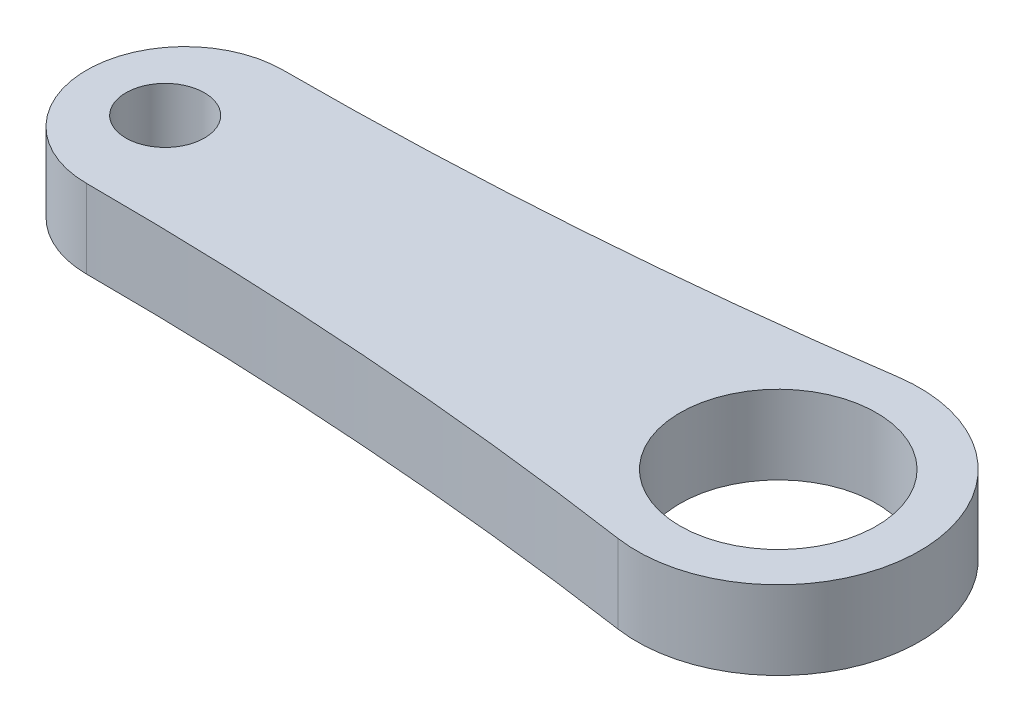
ISO-10303-21;
HEADER;
FILE_DESCRIPTION(('STEP AP214'),'2;1');
FILE_NAME('part.step','',(''),(''),'','','');
FILE_SCHEMA(('AUTOMOTIVE_DESIGN { 1 0 10303 214 1 1 1 1 }'));
ENDSEC;
DATA;
#1=APPLICATION_CONTEXT('core data for automotive mechanical design processes');
#2=APPLICATION_PROTOCOL_DEFINITION('international standard','automotive_design',2000,#1);
#3=PRODUCT_CONTEXT('',#1,'mechanical');
#4=PRODUCT('Part','Part','',(#3));
#5=PRODUCT_RELATED_PRODUCT_CATEGORY('part','',(#4));
#6=PRODUCT_DEFINITION_FORMATION('','',#4);
#7=PRODUCT_DEFINITION_CONTEXT('part definition',#1,'design');
#8=PRODUCT_DEFINITION('design','',#6,#7);
#9=PRODUCT_DEFINITION_SHAPE('','',#8);
#10=(LENGTH_UNIT() NAMED_UNIT(*) SI_UNIT(.MILLI.,.METRE.));
#11=(NAMED_UNIT(*) PLANE_ANGLE_UNIT() SI_UNIT($,.RADIAN.));
#12=(NAMED_UNIT(*) SI_UNIT($,.STERADIAN.) SOLID_ANGLE_UNIT());
#13=UNCERTAINTY_MEASURE_WITH_UNIT(LENGTH_MEASURE(1.E-05),#10,'distance_accuracy_value','');
#14=(GEOMETRIC_REPRESENTATION_CONTEXT(3) GLOBAL_UNCERTAINTY_ASSIGNED_CONTEXT((#13)) GLOBAL_UNIT_ASSIGNED_CONTEXT((#10,
#11,#12)) REPRESENTATION_CONTEXT('',''));
#15=CARTESIAN_POINT('',(0.,0.,0.));
#16=DIRECTION('',(0.,0.,1.));
#17=DIRECTION('',(1.,0.,0.));
#18=AXIS2_PLACEMENT_3D('',#15,#16,#17);
#19=CARTESIAN_POINT('',(-19.7657860921375,46.4356427517146,18.8449153965626));
#20=DIRECTION('',(0.,1.,0.));
#21=DIRECTION('',(0.,0.,1.));
#22=AXIS2_PLACEMENT_3D('',#19,#20,#21);
#23=PLANE('',#22);
#24=CARTESIAN_POINT('',(-4.65554131766961,46.4356427517146,18.8449153965626));
#25=DIRECTION('',(0.,1.,0.));
#26=DIRECTION('',(0.,0.,1.));
#27=AXIS2_PLACEMENT_3D('',#24,#25,#26);
#28=CIRCLE('',#27,2.5);
#29=CARTESIAN_POINT('',(-4.65554131766961,46.4356427517146,21.3449153965626));
#30=VERTEX_POINT('',#29);
#31=EDGE_CURVE('E102',#30,#30,#28,.T.);
#32=ORIENTED_EDGE('',*,*,#31,.F.);
#33=EDGE_LOOP('',(#32));
#34=FACE_BOUND('',#33,.T.);
#35=CARTESIAN_POINT('',(-4.65554131766961,46.4356427517146,18.8449153965626));
#36=DIRECTION('',(0.,1.,0.));
#37=DIRECTION('',(0.,0.,1.));
#38=AXIS2_PLACEMENT_3D('',#35,#36,#37);
#39=CIRCLE('',#38,3.6);
#40=CARTESIAN_POINT('',(-5.17626048145254,46.4356427517146,22.4070568244777));
#41=VERTEX_POINT('',#40);
#42=CARTESIAN_POINT('',(-5.17626048145254,46.4356427517146,15.2827739686475));
#43=VERTEX_POINT('',#42);
#44=EDGE_CURVE('E109',#41,#43,#39,.T.);
#45=ORIENTED_EDGE('',*,*,#44,.T.);
#46=CARTESIAN_POINT('',(-19.7853259098069,46.4356427517146,-84.6550827589713));
#47=DIRECTION('',(0.,1.,0.));
#48=DIRECTION('',(0.,0.,1.));
#49=AXIS2_PLACEMENT_3D('',#46,#47,#48);
#50=CIRCLE('',#49,101.);
#51=CARTESIAN_POINT('',(-19.7662580684097,46.4356427517146,16.3449154411149));
#52=VERTEX_POINT('',#51);
#53=EDGE_CURVE('E87',#43,#52,#50,.F.);
#54=ORIENTED_EDGE('',*,*,#53,.T.);
#55=CARTESIAN_POINT('',(-19.7657860921375,46.4356427517146,18.8449153965626));
#56=DIRECTION('',(0.,1.,0.));
#57=DIRECTION('',(0.,0.,1.));
#58=AXIS2_PLACEMENT_3D('',#55,#56,#57);
#59=CIRCLE('',#58,2.5);
#60=CARTESIAN_POINT('',(-19.7662580684097,46.4356427517146,21.3449153520103));
#61=VERTEX_POINT('',#60);
#62=EDGE_CURVE('E95',#52,#61,#59,.T.);
#63=ORIENTED_EDGE('',*,*,#62,.T.);
#64=CARTESIAN_POINT('',(-19.7853259098069,46.4356427517146,122.344913552097));
#65=DIRECTION('',(0.,1.,0.));
#66=DIRECTION('',(0.,0.,1.));
#67=AXIS2_PLACEMENT_3D('',#64,#65,#66);
#68=CIRCLE('',#67,101.);
#69=EDGE_CURVE('E11',#61,#41,#68,.F.);
#70=ORIENTED_EDGE('',*,*,#69,.T.);
#71=EDGE_LOOP('',(#45,#54,#63,#70));
#72=FACE_BOUND('',#71,.T.);
#73=CARTESIAN_POINT('',(-20.2657860921375,46.4356427517146,18.8449153965626));
#74=DIRECTION('',(0.,1.,0.));
#75=DIRECTION('',(0.,0.,1.));
#76=AXIS2_PLACEMENT_3D('',#73,#74,#75);
#77=CIRCLE('',#76,1.);
#78=CARTESIAN_POINT('',(-20.2657860921375,46.4356427517146,19.8449153965626));
#79=VERTEX_POINT('',#78);
#80=EDGE_CURVE('E120',#79,#79,#77,.T.);
#81=ORIENTED_EDGE('',*,*,#80,.F.);
#82=EDGE_LOOP('',(#81));
#83=FACE_BOUND('',#82,.T.);
#84=ADVANCED_FACE('F39',(#34,#72,#83),#23,.T.);
#85=CARTESIAN_POINT('',(-19.7657860921375,44.4356427517146,18.8449153965626));
#86=DIRECTION('',(0.,1.,0.));
#87=DIRECTION('',(0.,0.,1.));
#88=AXIS2_PLACEMENT_3D('',#85,#86,#87);
#89=PLANE('',#88);
#90=CARTESIAN_POINT('',(-19.7657860921375,44.4356427517146,18.8449153965626));
#91=DIRECTION('',(0.,1.,0.));
#92=DIRECTION('',(0.,0.,1.));
#93=AXIS2_PLACEMENT_3D('',#90,#91,#92);
#94=CIRCLE('',#93,2.5);
#95=CARTESIAN_POINT('',(-19.7662580684097,44.4356427517146,16.3449154411149));
#96=VERTEX_POINT('',#95);
#97=CARTESIAN_POINT('',(-19.7662580684097,44.4356427517146,21.3449153520103));
#98=VERTEX_POINT('',#97);
#99=EDGE_CURVE('E93',#96,#98,#94,.T.);
#100=ORIENTED_EDGE('',*,*,#99,.F.);
#101=CARTESIAN_POINT('',(-19.7853259098069,44.4356427517146,-84.6550827589713));
#102=DIRECTION('',(0.,1.,0.));
#103=DIRECTION('',(0.,0.,1.));
#104=AXIS2_PLACEMENT_3D('',#101,#102,#103);
#105=CIRCLE('',#104,101.);
#106=CARTESIAN_POINT('',(-5.17626048145254,44.4356427517146,15.2827739686475));
#107=VERTEX_POINT('',#106);
#108=EDGE_CURVE('E79',#96,#107,#105,.T.);
#109=ORIENTED_EDGE('',*,*,#108,.T.);
#110=CARTESIAN_POINT('',(-4.65554131766961,44.4356427517146,18.8449153965626));
#111=DIRECTION('',(0.,1.,0.));
#112=DIRECTION('',(0.,0.,1.));
#113=AXIS2_PLACEMENT_3D('',#110,#111,#112);
#114=CIRCLE('',#113,3.6);
#115=CARTESIAN_POINT('',(-5.17626048145254,44.4356427517146,22.4070568244777));
#116=VERTEX_POINT('',#115);
#117=EDGE_CURVE('E101',#116,#107,#114,.T.);
#118=ORIENTED_EDGE('',*,*,#117,.F.);
#119=CARTESIAN_POINT('',(-19.7853259098069,44.4356427517146,122.344913552097));
#120=DIRECTION('',(0.,1.,0.));
#121=DIRECTION('',(0.,0.,1.));
#122=AXIS2_PLACEMENT_3D('',#119,#120,#121);
#123=CIRCLE('',#122,101.);
#124=EDGE_CURVE('E47',#116,#98,#123,.T.);
#125=ORIENTED_EDGE('',*,*,#124,.T.);
#126=EDGE_LOOP('',(#100,#109,#118,#125));
#127=FACE_BOUND('',#126,.T.);
#128=CARTESIAN_POINT('',(-4.65554131766961,44.4356427517146,18.8449153965626));
#129=DIRECTION('',(0.,1.,0.));
#130=DIRECTION('',(0.,0.,1.));
#131=AXIS2_PLACEMENT_3D('',#128,#129,#130);
#132=CIRCLE('',#131,2.5);
#133=CARTESIAN_POINT('',(-4.65554131766961,44.4356427517146,21.3449153965626));
#134=VERTEX_POINT('',#133);
#135=EDGE_CURVE('E106',#134,#134,#132,.T.);
#136=ORIENTED_EDGE('',*,*,#135,.T.);
#137=EDGE_LOOP('',(#136));
#138=FACE_BOUND('',#137,.T.);
#139=CARTESIAN_POINT('',(-20.2657860921375,44.4356427517146,18.8449153965626));
#140=DIRECTION('',(0.,1.,0.));
#141=DIRECTION('',(0.,0.,1.));
#142=AXIS2_PLACEMENT_3D('',#139,#140,#141);
#143=CIRCLE('',#142,1.);
#144=CARTESIAN_POINT('',(-20.2657860921375,44.4356427517146,19.8449153965626));
#145=VERTEX_POINT('',#144);
#146=EDGE_CURVE('E122',#145,#145,#143,.T.);
#147=ORIENTED_EDGE('',*,*,#146,.T.);
#148=EDGE_LOOP('',(#147));
#149=FACE_BOUND('',#148,.T.);
#150=ADVANCED_FACE('F99',(#127,#138,#149),#89,.F.);
#151=CARTESIAN_POINT('',(-19.7657860921375,46.4356427517146,18.8449153965626));
#152=DIRECTION('',(0.,-1.,0.));
#153=DIRECTION('',(0.,0.,-1.));
#154=AXIS2_PLACEMENT_3D('',#151,#152,#153);
#155=CYLINDRICAL_SURFACE('',#154,2.5);
#156=ORIENTED_EDGE('',*,*,#62,.F.);
#157=DIRECTION('',(0.,-1.,0.));
#158=VECTOR('',#157,1.);
#159=CARTESIAN_POINT('',(-19.7662580684097,46.4356427517146,16.3449154411149));
#160=LINE('',#159,#158);
#161=EDGE_CURVE('E83',#52,#96,#160,.T.);
#162=ORIENTED_EDGE('',*,*,#161,.T.);
#163=ORIENTED_EDGE('',*,*,#99,.T.);
#164=DIRECTION('',(0.,-1.,0.));
#165=VECTOR('',#164,1.);
#166=CARTESIAN_POINT('',(-19.7662580684097,46.4356427517146,21.3449153520103));
#167=LINE('',#166,#165);
#168=EDGE_CURVE('E97',#98,#61,#167,.F.);
#169=ORIENTED_EDGE('',*,*,#168,.T.);
#170=EDGE_LOOP('',(#156,#162,#163,#169));
#171=FACE_BOUND('',#170,.T.);
#172=ADVANCED_FACE('F92',(#171),#155,.T.);
#173=CARTESIAN_POINT('',(-4.65554131766961,46.4356427517146,18.8449153965626));
#174=DIRECTION('',(0.,-1.,0.));
#175=DIRECTION('',(0.,0.,-1.));
#176=AXIS2_PLACEMENT_3D('',#173,#174,#175);
#177=CYLINDRICAL_SURFACE('',#176,3.6);
#178=ORIENTED_EDGE('',*,*,#117,.T.);
#179=DIRECTION('',(0.,-1.,0.));
#180=VECTOR('',#179,1.);
#181=CARTESIAN_POINT('',(-5.17626048145254,46.4356427517146,15.2827739686475));
#182=LINE('',#181,#180);
#183=EDGE_CURVE('E54',#107,#43,#182,.F.);
#184=ORIENTED_EDGE('',*,*,#183,.T.);
#185=ORIENTED_EDGE('',*,*,#44,.F.);
#186=DIRECTION('',(0.,-1.,0.));
#187=VECTOR('',#186,1.);
#188=CARTESIAN_POINT('',(-5.17626048145254,46.4356427517146,22.4070568244777));
#189=LINE('',#188,#187);
#190=EDGE_CURVE('E96',#41,#116,#189,.T.);
#191=ORIENTED_EDGE('',*,*,#190,.T.);
#192=EDGE_LOOP('',(#178,#184,#185,#191));
#193=FACE_BOUND('',#192,.T.);
#194=ADVANCED_FACE('F143',(#193),#177,.T.);
#195=CARTESIAN_POINT('',(-4.65554131766961,46.4356427517146,18.8449153965626));
#196=DIRECTION('',(0.,-1.,0.));
#197=DIRECTION('',(0.,0.,-1.));
#198=AXIS2_PLACEMENT_3D('',#195,#196,#197);
#199=CYLINDRICAL_SURFACE('',#198,2.5);
#200=ORIENTED_EDGE('',*,*,#31,.T.);
#201=EDGE_LOOP('',(#200));
#202=FACE_BOUND('',#201,.T.);
#203=ORIENTED_EDGE('',*,*,#135,.F.);
#204=EDGE_LOOP('',(#203));
#205=FACE_BOUND('',#204,.T.);
#206=ADVANCED_FACE('F140',(#202,#205),#199,.F.);
#207=CARTESIAN_POINT('',(-20.2657860921375,46.4356427517146,18.8449153965626));
#208=DIRECTION('',(0.,-1.,0.));
#209=DIRECTION('',(0.,0.,-1.));
#210=AXIS2_PLACEMENT_3D('',#207,#208,#209);
#211=CYLINDRICAL_SURFACE('',#210,1.);
#212=ORIENTED_EDGE('',*,*,#80,.T.);
#213=EDGE_LOOP('',(#212));
#214=FACE_BOUND('',#213,.T.);
#215=ORIENTED_EDGE('',*,*,#146,.F.);
#216=EDGE_LOOP('',(#215));
#217=FACE_BOUND('',#216,.T.);
#218=ADVANCED_FACE('F128',(#214,#217),#211,.F.);
#219=CARTESIAN_POINT('',(-19.7853259098069,46.4356427517146,-84.6550827589713));
#220=DIRECTION('',(0.,1.,0.));
#221=DIRECTION('',(0.,0.,1.));
#222=AXIS2_PLACEMENT_3D('',#219,#220,#221);
#223=CYLINDRICAL_SURFACE('',#222,101.);
#224=ORIENTED_EDGE('',*,*,#53,.F.);
#225=ORIENTED_EDGE('',*,*,#183,.F.);
#226=ORIENTED_EDGE('',*,*,#108,.F.);
#227=ORIENTED_EDGE('',*,*,#161,.F.);
#228=EDGE_LOOP('',(#224,#225,#226,#227));
#229=FACE_BOUND('',#228,.T.);
#230=ADVANCED_FACE('F82',(#229),#223,.F.);
#231=CARTESIAN_POINT('',(-19.7853259098069,46.4356427517146,122.344913552097));
#232=DIRECTION('',(0.,1.,0.));
#233=DIRECTION('',(0.,0.,1.));
#234=AXIS2_PLACEMENT_3D('',#231,#232,#233);
#235=CYLINDRICAL_SURFACE('',#234,101.);
#236=ORIENTED_EDGE('',*,*,#69,.F.);
#237=ORIENTED_EDGE('',*,*,#168,.F.);
#238=ORIENTED_EDGE('',*,*,#124,.F.);
#239=ORIENTED_EDGE('',*,*,#190,.F.);
#240=EDGE_LOOP('',(#236,#237,#238,#239));
#241=FACE_BOUND('',#240,.T.);
#242=ADVANCED_FACE('F41',(#241),#235,.F.);
#243=CLOSED_SHELL('',(#84,#150,#172,#194,#206,#218,#230,#242));
#244=MANIFOLD_SOLID_BREP('B2',#243);
#245=ADVANCED_BREP_SHAPE_REPRESENTATION('',(#18,#244),#14);
#246=SHAPE_DEFINITION_REPRESENTATION(#9,#245);
ENDSEC;
END-ISO-10303-21;
